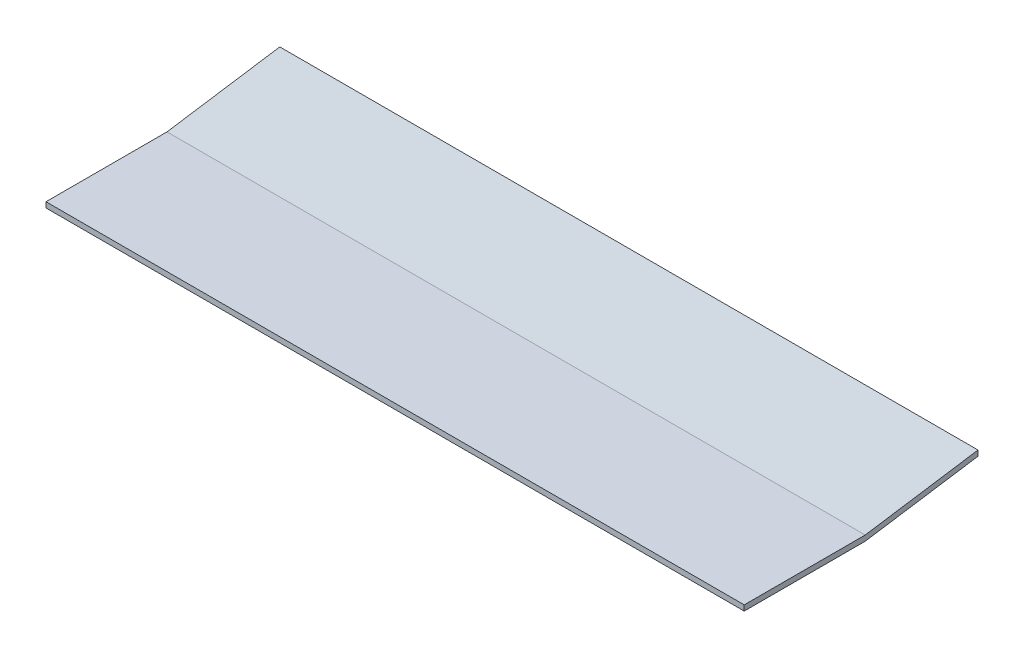
ISO-10303-21;
HEADER;
FILE_DESCRIPTION(('STEP AP214'),'2;1');
FILE_NAME('part.step','',(''),(''),'','','');
FILE_SCHEMA(('AUTOMOTIVE_DESIGN { 1 0 10303 214 1 1 1 1 }'));
ENDSEC;
DATA;
#1=APPLICATION_CONTEXT('core data for automotive mechanical design processes');
#2=APPLICATION_PROTOCOL_DEFINITION('international standard','automotive_design',2000,#1);
#3=PRODUCT_CONTEXT('',#1,'mechanical');
#4=PRODUCT('Part','Part','',(#3));
#5=PRODUCT_RELATED_PRODUCT_CATEGORY('part','',(#4));
#6=PRODUCT_DEFINITION_FORMATION('','',#4);
#7=PRODUCT_DEFINITION_CONTEXT('part definition',#1,'design');
#8=PRODUCT_DEFINITION('design','',#6,#7);
#9=PRODUCT_DEFINITION_SHAPE('','',#8);
#10=(LENGTH_UNIT() NAMED_UNIT(*) SI_UNIT(.MILLI.,.METRE.));
#11=(NAMED_UNIT(*) PLANE_ANGLE_UNIT() SI_UNIT($,.RADIAN.));
#12=(NAMED_UNIT(*) SI_UNIT($,.STERADIAN.) SOLID_ANGLE_UNIT());
#13=UNCERTAINTY_MEASURE_WITH_UNIT(LENGTH_MEASURE(1.E-05),#10,'distance_accuracy_value','');
#14=(GEOMETRIC_REPRESENTATION_CONTEXT(3) GLOBAL_UNCERTAINTY_ASSIGNED_CONTEXT((#13)) GLOBAL_UNIT_ASSIGNED_CONTEXT((#10,
#11,#12)) REPRESENTATION_CONTEXT('',''));
#15=CARTESIAN_POINT('',(0.,0.,0.));
#16=DIRECTION('',(0.,0.,1.));
#17=DIRECTION('',(1.,0.,0.));
#18=AXIS2_PLACEMENT_3D('',#15,#16,#17);
#19=CARTESIAN_POINT('',(6170.,-32.5166233142697,-66.3899570951851));
#20=DIRECTION('',(0.,0.,1.));
#21=DIRECTION('',(1.,0.,0.));
#22=AXIS2_PLACEMENT_3D('',#19,#20,#21);
#23=PLANE('',#22);
#24=DIRECTION('',(0.,1.,0.));
#25=VECTOR('',#24,1.);
#26=CARTESIAN_POINT('',(0.,-32.5166233142697,-66.3899570951851));
#27=LINE('',#26,#25);
#28=CARTESIAN_POINT('',(0.,-32.5166233142697,-66.3899570951851));
#29=VERTEX_POINT('',#28);
#30=CARTESIAN_POINT('',(0.,15.4304783092325,-66.3899570951851));
#31=VERTEX_POINT('',#30);
#32=EDGE_CURVE('E122',#29,#31,#27,.T.);
#33=ORIENTED_EDGE('',*,*,#32,.T.);
#34=DIRECTION('',(-1.,0.,0.));
#35=VECTOR('',#34,1.);
#36=CARTESIAN_POINT('',(6170.,15.4304783092325,-66.3899570951851));
#37=LINE('',#36,#35);
#38=CARTESIAN_POINT('',(6170.,15.4304783092325,-66.3899570951851));
#39=VERTEX_POINT('',#38);
#40=EDGE_CURVE('E11',#39,#31,#37,.T.);
#41=ORIENTED_EDGE('',*,*,#40,.F.);
#42=DIRECTION('',(0.,1.,0.));
#43=VECTOR('',#42,1.);
#44=CARTESIAN_POINT('',(6170.,-32.5166233142697,-66.3899570951851));
#45=LINE('',#44,#43);
#46=CARTESIAN_POINT('',(6170.,-32.5166233142697,-66.3899570951851));
#47=VERTEX_POINT('',#46);
#48=EDGE_CURVE('E132',#47,#39,#45,.T.);
#49=ORIENTED_EDGE('',*,*,#48,.F.);
#50=DIRECTION('',(-1.,0.,0.));
#51=VECTOR('',#50,1.);
#52=CARTESIAN_POINT('',(6170.,-32.5166233142697,-66.3899570951851));
#53=LINE('',#52,#51);
#54=EDGE_CURVE('E118',#47,#29,#53,.T.);
#55=ORIENTED_EDGE('',*,*,#54,.T.);
#56=EDGE_LOOP('',(#33,#41,#49,#55));
#57=FACE_BOUND('',#56,.T.);
#58=ADVANCED_FACE('F38',(#57),#23,.F.);
#59=CARTESIAN_POINT('',(6170.,15.4304783092325,-66.3899570951851));
#60=DIRECTION('',(0.,-0.988555499546629,-0.150857629293696));
#61=DIRECTION('',(0.,0.150857629293696,-0.988555499546629));
#62=AXIS2_PLACEMENT_3D('',#59,#60,#61);
#63=PLANE('',#62);
#64=DIRECTION('',(0.,-0.150857629293696,0.988555499546629));
#65=VECTOR('',#64,1.);
#66=CARTESIAN_POINT('',(0.,15.4304783092325,-66.3899570951851));
#67=LINE('',#66,#65);
#68=CARTESIAN_POINT('',(0.,-136.649239626981,930.173771495943));
#69=VERTEX_POINT('',#68);
#70=EDGE_CURVE('E125',#31,#69,#67,.T.);
#71=ORIENTED_EDGE('',*,*,#70,.T.);
#72=DIRECTION('',(-1.,0.,0.));
#73=VECTOR('',#72,1.);
#74=CARTESIAN_POINT('',(6170.,-136.649239626981,930.173771495943));
#75=LINE('',#74,#73);
#76=CARTESIAN_POINT('',(6170.,-136.649239626981,930.173771495943));
#77=VERTEX_POINT('',#76);
#78=EDGE_CURVE('E46',#77,#69,#75,.T.);
#79=ORIENTED_EDGE('',*,*,#78,.F.);
#80=DIRECTION('',(0.,-0.150857629293696,0.988555499546629));
#81=VECTOR('',#80,1.);
#82=CARTESIAN_POINT('',(6170.,15.4304783092325,-66.3899570951851));
#83=LINE('',#82,#81);
#84=EDGE_CURVE('E91',#39,#77,#83,.T.);
#85=ORIENTED_EDGE('',*,*,#84,.F.);
#86=ORIENTED_EDGE('',*,*,#40,.T.);
#87=EDGE_LOOP('',(#71,#79,#85,#86));
#88=FACE_BOUND('',#87,.T.);
#89=ADVANCED_FACE('F156',(#88),#63,.F.);
#90=CARTESIAN_POINT('',(6170.,-136.649239626981,930.173771495943));
#91=DIRECTION('',(0.,-1.,0.));
#92=DIRECTION('',(0.,0.,-1.));
#93=AXIS2_PLACEMENT_3D('',#90,#91,#92);
#94=PLANE('',#93);
#95=DIRECTION('',(0.,0.,1.));
#96=VECTOR('',#95,1.);
#97=CARTESIAN_POINT('',(0.,-136.649239626981,930.173771495943));
#98=LINE('',#97,#96);
#99=CARTESIAN_POINT('',(0.,-136.649239626981,1999.39413770004));
#100=VERTEX_POINT('',#99);
#101=EDGE_CURVE('E127',#69,#100,#98,.T.);
#102=ORIENTED_EDGE('',*,*,#101,.T.);
#103=DIRECTION('',(-1.,0.,0.));
#104=VECTOR('',#103,1.);
#105=CARTESIAN_POINT('',(6170.,-136.649239626981,1999.39413770004));
#106=LINE('',#105,#104);
#107=CARTESIAN_POINT('',(6170.,-136.649239626981,1999.39413770004));
#108=VERTEX_POINT('',#107);
#109=EDGE_CURVE('E113',#108,#100,#106,.T.);
#110=ORIENTED_EDGE('',*,*,#109,.F.);
#111=DIRECTION('',(0.,0.,1.));
#112=VECTOR('',#111,1.);
#113=CARTESIAN_POINT('',(6170.,-136.649239626981,930.173771495943));
#114=LINE('',#113,#112);
#115=EDGE_CURVE('E104',#77,#108,#114,.T.);
#116=ORIENTED_EDGE('',*,*,#115,.F.);
#117=ORIENTED_EDGE('',*,*,#78,.T.);
#118=EDGE_LOOP('',(#102,#110,#116,#117));
#119=FACE_BOUND('',#118,.T.);
#120=ADVANCED_FACE('F138',(#119),#94,.F.);
#121=CARTESIAN_POINT('',(6170.,-136.649239626981,1999.39413770004));
#122=DIRECTION('',(0.,0.,-1.));
#123=DIRECTION('',(-1.,0.,0.));
#124=AXIS2_PLACEMENT_3D('',#121,#122,#123);
#125=PLANE('',#124);
#126=DIRECTION('',(0.,-1.,0.));
#127=VECTOR('',#126,1.);
#128=CARTESIAN_POINT('',(0.,-136.649239626981,1999.39413770004));
#129=LINE('',#128,#127);
#130=CARTESIAN_POINT('',(0.,-184.596341250483,1999.39413770004));
#131=VERTEX_POINT('',#130);
#132=EDGE_CURVE('E112',#100,#131,#129,.T.);
#133=ORIENTED_EDGE('',*,*,#132,.T.);
#134=DIRECTION('',(-1.,0.,0.));
#135=VECTOR('',#134,1.);
#136=CARTESIAN_POINT('',(6170.,-184.596341250483,1999.39413770004));
#137=LINE('',#136,#135);
#138=CARTESIAN_POINT('',(6170.,-184.596341250483,1999.39413770004));
#139=VERTEX_POINT('',#138);
#140=EDGE_CURVE('E109',#139,#131,#137,.T.);
#141=ORIENTED_EDGE('',*,*,#140,.F.);
#142=DIRECTION('',(0.,-1.,0.));
#143=VECTOR('',#142,1.);
#144=CARTESIAN_POINT('',(6170.,-136.649239626981,1999.39413770004));
#145=LINE('',#144,#143);
#146=EDGE_CURVE('E98',#108,#139,#145,.T.);
#147=ORIENTED_EDGE('',*,*,#146,.F.);
#148=ORIENTED_EDGE('',*,*,#109,.T.);
#149=EDGE_LOOP('',(#133,#141,#147,#148));
#150=FACE_BOUND('',#149,.T.);
#151=ADVANCED_FACE('F110',(#150),#125,.F.);
#152=CARTESIAN_POINT('',(6170.,-184.596341250483,1999.39413770004));
#153=DIRECTION('',(0.,1.,0.));
#154=DIRECTION('',(0.,0.,1.));
#155=AXIS2_PLACEMENT_3D('',#152,#153,#154);
#156=PLANE('',#155);
#157=DIRECTION('',(0.,0.,-1.));
#158=VECTOR('',#157,1.);
#159=CARTESIAN_POINT('',(0.,-184.596341250483,1999.39413770004));
#160=LINE('',#159,#158);
#161=CARTESIAN_POINT('',(0.,-184.596341250483,930.173771495943));
#162=VERTEX_POINT('',#161);
#163=EDGE_CURVE('E77',#131,#162,#160,.T.);
#164=ORIENTED_EDGE('',*,*,#163,.T.);
#165=DIRECTION('',(-1.,0.,0.));
#166=VECTOR('',#165,1.);
#167=CARTESIAN_POINT('',(6170.,-184.596341250483,930.173771495943));
#168=LINE('',#167,#166);
#169=CARTESIAN_POINT('',(6170.,-184.596341250483,930.173771495943));
#170=VERTEX_POINT('',#169);
#171=EDGE_CURVE('E114',#170,#162,#168,.T.);
#172=ORIENTED_EDGE('',*,*,#171,.F.);
#173=DIRECTION('',(0.,0.,-1.));
#174=VECTOR('',#173,1.);
#175=CARTESIAN_POINT('',(6170.,-184.596341250483,1999.39413770004));
#176=LINE('',#175,#174);
#177=EDGE_CURVE('E102',#139,#170,#176,.T.);
#178=ORIENTED_EDGE('',*,*,#177,.F.);
#179=ORIENTED_EDGE('',*,*,#140,.T.);
#180=EDGE_LOOP('',(#164,#172,#178,#179));
#181=FACE_BOUND('',#180,.T.);
#182=ADVANCED_FACE('F116',(#181),#156,.F.);
#183=CARTESIAN_POINT('',(6170.,-184.596341250483,930.173771495943));
#184=DIRECTION('',(0.,0.988555499546629,0.150857629293696));
#185=DIRECTION('',(0.,-0.150857629293696,0.988555499546629));
#186=AXIS2_PLACEMENT_3D('',#183,#184,#185);
#187=PLANE('',#186);
#188=DIRECTION('',(0.,0.150857629293696,-0.988555499546629));
#189=VECTOR('',#188,1.);
#190=CARTESIAN_POINT('',(0.,-184.596341250483,930.173771495943));
#191=LINE('',#190,#189);
#192=EDGE_CURVE('E83',#162,#29,#191,.T.);
#193=ORIENTED_EDGE('',*,*,#192,.T.);
#194=ORIENTED_EDGE('',*,*,#54,.F.);
#195=DIRECTION('',(0.,0.150857629293696,-0.988555499546629));
#196=VECTOR('',#195,1.);
#197=CARTESIAN_POINT('',(6170.,-184.596341250483,930.173771495943));
#198=LINE('',#197,#196);
#199=EDGE_CURVE('E54',#170,#47,#198,.T.);
#200=ORIENTED_EDGE('',*,*,#199,.F.);
#201=ORIENTED_EDGE('',*,*,#171,.T.);
#202=EDGE_LOOP('',(#193,#194,#200,#201));
#203=FACE_BOUND('',#202,.T.);
#204=ADVANCED_FACE('F145',(#203),#187,.F.);
#205=CARTESIAN_POINT('',(6170.,0.,0.));
#206=DIRECTION('',(1.,0.,0.));
#207=DIRECTION('',(0.,0.,-1.));
#208=AXIS2_PLACEMENT_3D('',#205,#206,#207);
#209=PLANE('',#208);
#210=ORIENTED_EDGE('',*,*,#48,.T.);
#211=ORIENTED_EDGE('',*,*,#84,.T.);
#212=ORIENTED_EDGE('',*,*,#115,.T.);
#213=ORIENTED_EDGE('',*,*,#146,.T.);
#214=ORIENTED_EDGE('',*,*,#177,.T.);
#215=ORIENTED_EDGE('',*,*,#199,.T.);
#216=EDGE_LOOP('',(#210,#211,#212,#213,#214,#215));
#217=FACE_BOUND('',#216,.T.);
#218=ADVANCED_FACE('F100',(#217),#209,.T.);
#219=CARTESIAN_POINT('',(0.,0.,0.));
#220=DIRECTION('',(1.,0.,0.));
#221=DIRECTION('',(0.,0.,-1.));
#222=AXIS2_PLACEMENT_3D('',#219,#220,#221);
#223=PLANE('',#222);
#224=ORIENTED_EDGE('',*,*,#32,.F.);
#225=ORIENTED_EDGE('',*,*,#192,.F.);
#226=ORIENTED_EDGE('',*,*,#163,.F.);
#227=ORIENTED_EDGE('',*,*,#132,.F.);
#228=ORIENTED_EDGE('',*,*,#101,.F.);
#229=ORIENTED_EDGE('',*,*,#70,.F.);
#230=EDGE_LOOP('',(#224,#225,#226,#227,#228,#229));
#231=FACE_BOUND('',#230,.T.);
#232=ADVANCED_FACE('F141',(#231),#223,.F.);
#233=CLOSED_SHELL('',(#58,#89,#120,#151,#182,#204,#218,#232));
#234=MANIFOLD_SOLID_BREP('B2',#233);
#235=ADVANCED_BREP_SHAPE_REPRESENTATION('',(#18,#234),#14);
#236=SHAPE_DEFINITION_REPRESENTATION(#9,#235);
ENDSEC;
END-ISO-10303-21;
